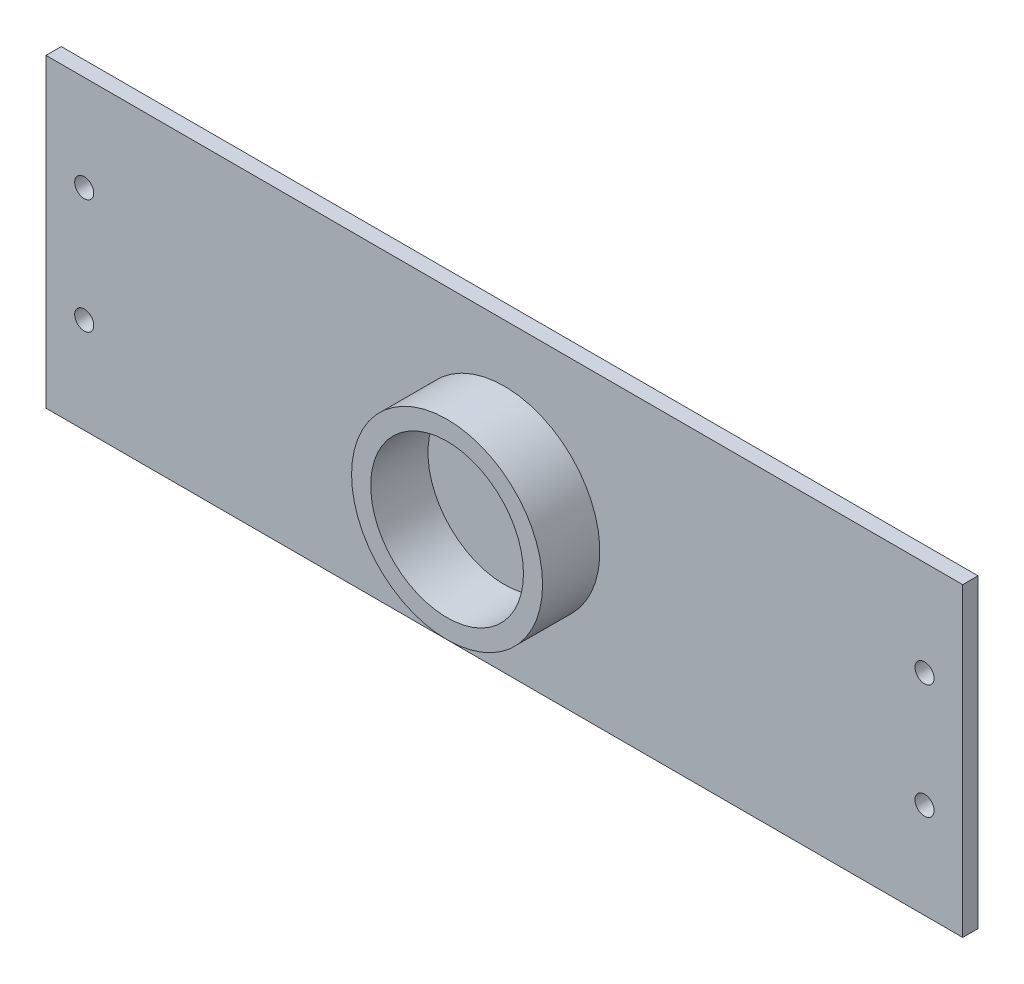
ISO-10303-21;
HEADER;
FILE_DESCRIPTION(('STEP AP214'),'2;1');
FILE_NAME('part.step','',(''),(''),'','','');
FILE_SCHEMA(('AUTOMOTIVE_DESIGN { 1 0 10303 214 1 1 1 1 }'));
ENDSEC;
DATA;
#1=APPLICATION_CONTEXT('core data for automotive mechanical design processes');
#2=APPLICATION_PROTOCOL_DEFINITION('international standard','automotive_design',2000,#1);
#3=PRODUCT_CONTEXT('',#1,'mechanical');
#4=PRODUCT('Part','Part','',(#3));
#5=PRODUCT_RELATED_PRODUCT_CATEGORY('part','',(#4));
#6=PRODUCT_DEFINITION_FORMATION('','',#4);
#7=PRODUCT_DEFINITION_CONTEXT('part definition',#1,'design');
#8=PRODUCT_DEFINITION('design','',#6,#7);
#9=PRODUCT_DEFINITION_SHAPE('','',#8);
#10=(LENGTH_UNIT() NAMED_UNIT(*) SI_UNIT(.MILLI.,.METRE.));
#11=(NAMED_UNIT(*) PLANE_ANGLE_UNIT() SI_UNIT($,.RADIAN.));
#12=(NAMED_UNIT(*) SI_UNIT($,.STERADIAN.) SOLID_ANGLE_UNIT());
#13=UNCERTAINTY_MEASURE_WITH_UNIT(LENGTH_MEASURE(1.E-05),#10,'distance_accuracy_value','');
#14=(GEOMETRIC_REPRESENTATION_CONTEXT(3) GLOBAL_UNCERTAINTY_ASSIGNED_CONTEXT((#13)) GLOBAL_UNIT_ASSIGNED_CONTEXT((#10,
#11,#12)) REPRESENTATION_CONTEXT('',''));
#15=CARTESIAN_POINT('',(0.,0.,0.));
#16=DIRECTION('',(0.,0.,1.));
#17=DIRECTION('',(1.,0.,0.));
#18=AXIS2_PLACEMENT_3D('',#15,#16,#17);
#19=CARTESIAN_POINT('',(0.,0.,4.));
#20=DIRECTION('',(0.,0.,-1.));
#21=DIRECTION('',(-1.,0.,0.));
#22=AXIS2_PLACEMENT_3D('',#19,#20,#21);
#23=PLANE('',#22);
#24=CARTESIAN_POINT('',(120.,40.,4.));
#25=DIRECTION('',(0.,0.,-1.));
#26=DIRECTION('',(-1.,0.,0.));
#27=AXIS2_PLACEMENT_3D('',#24,#25,#26);
#28=CIRCLE('',#27,25.);
#29=CARTESIAN_POINT('',(95.,40.,4.));
#30=VERTEX_POINT('',#29);
#31=EDGE_CURVE('E11',#30,#30,#28,.F.);
#32=ORIENTED_EDGE('',*,*,#31,.F.);
#33=EDGE_LOOP('',(#32));
#34=FACE_BOUND('',#33,.T.);
#35=DIRECTION('',(0.,-1.,0.));
#36=VECTOR('',#35,1.);
#37=CARTESIAN_POINT('',(0.,0.,4.));
#38=LINE('',#37,#36);
#39=CARTESIAN_POINT('',(0.,80.,4.));
#40=VERTEX_POINT('',#39);
#41=CARTESIAN_POINT('',(0.,0.,4.));
#42=VERTEX_POINT('',#41);
#43=EDGE_CURVE('E99',#40,#42,#38,.T.);
#44=ORIENTED_EDGE('',*,*,#43,.T.);
#45=DIRECTION('',(1.,0.,0.));
#46=VECTOR('',#45,1.);
#47=CARTESIAN_POINT('',(0.,0.,4.));
#48=LINE('',#47,#46);
#49=CARTESIAN_POINT('',(240.,0.,4.));
#50=VERTEX_POINT('',#49);
#51=EDGE_CURVE('E94',#42,#50,#48,.T.);
#52=ORIENTED_EDGE('',*,*,#51,.T.);
#53=DIRECTION('',(0.,1.,0.));
#54=VECTOR('',#53,1.);
#55=CARTESIAN_POINT('',(240.,0.,4.));
#56=LINE('',#55,#54);
#57=CARTESIAN_POINT('',(240.,80.,4.));
#58=VERTEX_POINT('',#57);
#59=EDGE_CURVE('E97',#50,#58,#56,.T.);
#60=ORIENTED_EDGE('',*,*,#59,.T.);
#61=DIRECTION('',(-1.,0.,0.));
#62=VECTOR('',#61,1.);
#63=CARTESIAN_POINT('',(0.,80.,4.));
#64=LINE('',#63,#62);
#65=EDGE_CURVE('E63',#58,#40,#64,.T.);
#66=ORIENTED_EDGE('',*,*,#65,.T.);
#67=EDGE_LOOP('',(#44,#52,#60,#66));
#68=FACE_BOUND('',#67,.T.);
#69=CARTESIAN_POINT('',(10.,55.,4.));
#70=DIRECTION('',(0.,0.,1.));
#71=DIRECTION('',(1.,0.,0.));
#72=AXIS2_PLACEMENT_3D('',#69,#70,#71);
#73=CIRCLE('',#72,2.5);
#74=CARTESIAN_POINT('',(12.5,55.,4.));
#75=VERTEX_POINT('',#74);
#76=EDGE_CURVE('E121',#75,#75,#73,.T.);
#77=ORIENTED_EDGE('',*,*,#76,.F.);
#78=EDGE_LOOP('',(#77));
#79=FACE_BOUND('',#78,.T.);
#80=CARTESIAN_POINT('',(10.,25.,4.));
#81=DIRECTION('',(0.,0.,1.));
#82=DIRECTION('',(1.,0.,0.));
#83=AXIS2_PLACEMENT_3D('',#80,#81,#82);
#84=CIRCLE('',#83,2.5);
#85=CARTESIAN_POINT('',(12.5,25.,4.));
#86=VERTEX_POINT('',#85);
#87=EDGE_CURVE('E168',#86,#86,#84,.T.);
#88=ORIENTED_EDGE('',*,*,#87,.F.);
#89=EDGE_LOOP('',(#88));
#90=FACE_BOUND('',#89,.T.);
#91=CARTESIAN_POINT('',(230.,25.,4.));
#92=DIRECTION('',(0.,0.,1.));
#93=DIRECTION('',(-1.,0.,0.));
#94=AXIS2_PLACEMENT_3D('',#91,#92,#93);
#95=CIRCLE('',#94,2.50000000000002);
#96=CARTESIAN_POINT('',(227.5,25.,4.));
#97=VERTEX_POINT('',#96);
#98=EDGE_CURVE('E161',#97,#97,#95,.T.);
#99=ORIENTED_EDGE('',*,*,#98,.F.);
#100=EDGE_LOOP('',(#99));
#101=FACE_BOUND('',#100,.T.);
#102=CARTESIAN_POINT('',(230.,55.,4.));
#103=DIRECTION('',(0.,0.,1.));
#104=DIRECTION('',(-1.,0.,0.));
#105=AXIS2_PLACEMENT_3D('',#102,#103,#104);
#106=CIRCLE('',#105,2.50000000000002);
#107=CARTESIAN_POINT('',(227.5,55.,4.));
#108=VERTEX_POINT('',#107);
#109=EDGE_CURVE('E149',#108,#108,#106,.T.);
#110=ORIENTED_EDGE('',*,*,#109,.F.);
#111=EDGE_LOOP('',(#110));
#112=FACE_BOUND('',#111,.T.);
#113=ADVANCED_FACE('F45',(#34,#68,#79,#90,#101,#112),#23,.F.);
#114=CARTESIAN_POINT('',(0.,0.,0.));
#115=DIRECTION('',(0.,0.,-1.));
#116=DIRECTION('',(-1.,0.,0.));
#117=AXIS2_PLACEMENT_3D('',#114,#115,#116);
#118=PLANE('',#117);
#119=CARTESIAN_POINT('',(230.,25.,0.));
#120=DIRECTION('',(0.,0.,1.));
#121=DIRECTION('',(-1.,0.,0.));
#122=AXIS2_PLACEMENT_3D('',#119,#120,#121);
#123=CIRCLE('',#122,2.50000000000002);
#124=CARTESIAN_POINT('',(227.5,25.,0.));
#125=VERTEX_POINT('',#124);
#126=EDGE_CURVE('E155',#125,#125,#123,.T.);
#127=ORIENTED_EDGE('',*,*,#126,.T.);
#128=EDGE_LOOP('',(#127));
#129=FACE_BOUND('',#128,.T.);
#130=CARTESIAN_POINT('',(10.,55.,0.));
#131=DIRECTION('',(0.,0.,1.));
#132=DIRECTION('',(1.,0.,0.));
#133=AXIS2_PLACEMENT_3D('',#130,#131,#132);
#134=CIRCLE('',#133,2.5);
#135=CARTESIAN_POINT('',(12.5,55.,0.));
#136=VERTEX_POINT('',#135);
#137=EDGE_CURVE('E172',#136,#136,#134,.T.);
#138=ORIENTED_EDGE('',*,*,#137,.T.);
#139=EDGE_LOOP('',(#138));
#140=FACE_BOUND('',#139,.T.);
#141=DIRECTION('',(0.,-1.,0.));
#142=VECTOR('',#141,1.);
#143=CARTESIAN_POINT('',(0.,0.,0.));
#144=LINE('',#143,#142);
#145=CARTESIAN_POINT('',(0.,80.,0.));
#146=VERTEX_POINT('',#145);
#147=CARTESIAN_POINT('',(0.,0.,0.));
#148=VERTEX_POINT('',#147);
#149=EDGE_CURVE('E117',#146,#148,#144,.T.);
#150=ORIENTED_EDGE('',*,*,#149,.F.);
#151=DIRECTION('',(-1.,0.,0.));
#152=VECTOR('',#151,1.);
#153=CARTESIAN_POINT('',(0.,80.,0.));
#154=LINE('',#153,#152);
#155=CARTESIAN_POINT('',(240.,80.,0.));
#156=VERTEX_POINT('',#155);
#157=EDGE_CURVE('E86',#156,#146,#154,.T.);
#158=ORIENTED_EDGE('',*,*,#157,.F.);
#159=DIRECTION('',(0.,1.,0.));
#160=VECTOR('',#159,1.);
#161=CARTESIAN_POINT('',(240.,0.,0.));
#162=LINE('',#161,#160);
#163=CARTESIAN_POINT('',(240.,0.,0.));
#164=VERTEX_POINT('',#163);
#165=EDGE_CURVE('E80',#164,#156,#162,.T.);
#166=ORIENTED_EDGE('',*,*,#165,.F.);
#167=DIRECTION('',(1.,0.,0.));
#168=VECTOR('',#167,1.);
#169=CARTESIAN_POINT('',(0.,0.,0.));
#170=LINE('',#169,#168);
#171=EDGE_CURVE('E105',#148,#164,#170,.T.);
#172=ORIENTED_EDGE('',*,*,#171,.F.);
#173=EDGE_LOOP('',(#150,#158,#166,#172));
#174=FACE_BOUND('',#173,.T.);
#175=CARTESIAN_POINT('',(10.,25.,0.));
#176=DIRECTION('',(0.,0.,1.));
#177=DIRECTION('',(1.,0.,0.));
#178=AXIS2_PLACEMENT_3D('',#175,#176,#177);
#179=CIRCLE('',#178,2.5);
#180=CARTESIAN_POINT('',(12.5,25.,0.));
#181=VERTEX_POINT('',#180);
#182=EDGE_CURVE('E143',#181,#181,#179,.T.);
#183=ORIENTED_EDGE('',*,*,#182,.T.);
#184=EDGE_LOOP('',(#183));
#185=FACE_BOUND('',#184,.T.);
#186=CARTESIAN_POINT('',(230.,55.,0.));
#187=DIRECTION('',(0.,0.,1.));
#188=DIRECTION('',(-1.,0.,0.));
#189=AXIS2_PLACEMENT_3D('',#186,#187,#188);
#190=CIRCLE('',#189,2.50000000000002);
#191=CARTESIAN_POINT('',(227.5,55.,0.));
#192=VERTEX_POINT('',#191);
#193=EDGE_CURVE('E146',#192,#192,#190,.T.);
#194=ORIENTED_EDGE('',*,*,#193,.T.);
#195=EDGE_LOOP('',(#194));
#196=FACE_BOUND('',#195,.T.);
#197=ADVANCED_FACE('F135',(#129,#140,#174,#185,#196),#118,.T.);
#198=CARTESIAN_POINT('',(0.,0.,4.));
#199=DIRECTION('',(1.,0.,0.));
#200=DIRECTION('',(0.,0.,-1.));
#201=AXIS2_PLACEMENT_3D('',#198,#199,#200);
#202=PLANE('',#201);
#203=ORIENTED_EDGE('',*,*,#149,.T.);
#204=DIRECTION('',(0.,0.,-1.));
#205=VECTOR('',#204,1.);
#206=CARTESIAN_POINT('',(0.,0.,4.));
#207=LINE('',#206,#205);
#208=EDGE_CURVE('E55',#42,#148,#207,.T.);
#209=ORIENTED_EDGE('',*,*,#208,.F.);
#210=ORIENTED_EDGE('',*,*,#43,.F.);
#211=DIRECTION('',(0.,0.,-1.));
#212=VECTOR('',#211,1.);
#213=CARTESIAN_POINT('',(0.,80.,4.));
#214=LINE('',#213,#212);
#215=EDGE_CURVE('E113',#40,#146,#214,.T.);
#216=ORIENTED_EDGE('',*,*,#215,.T.);
#217=EDGE_LOOP('',(#203,#209,#210,#216));
#218=FACE_BOUND('',#217,.T.);
#219=ADVANCED_FACE('F47',(#218),#202,.F.);
#220=CARTESIAN_POINT('',(0.,0.,4.));
#221=DIRECTION('',(0.,1.,0.));
#222=DIRECTION('',(0.,0.,1.));
#223=AXIS2_PLACEMENT_3D('',#220,#221,#222);
#224=PLANE('',#223);
#225=ORIENTED_EDGE('',*,*,#171,.T.);
#226=DIRECTION('',(0.,0.,-1.));
#227=VECTOR('',#226,1.);
#228=CARTESIAN_POINT('',(240.,0.,4.));
#229=LINE('',#228,#227);
#230=EDGE_CURVE('E103',#50,#164,#229,.T.);
#231=ORIENTED_EDGE('',*,*,#230,.F.);
#232=ORIENTED_EDGE('',*,*,#51,.F.);
#233=ORIENTED_EDGE('',*,*,#208,.T.);
#234=EDGE_LOOP('',(#225,#231,#232,#233));
#235=FACE_BOUND('',#234,.T.);
#236=ADVANCED_FACE('F104',(#235),#224,.F.);
#237=CARTESIAN_POINT('',(240.,0.,4.));
#238=DIRECTION('',(-1.,0.,0.));
#239=DIRECTION('',(0.,0.,1.));
#240=AXIS2_PLACEMENT_3D('',#237,#238,#239);
#241=PLANE('',#240);
#242=ORIENTED_EDGE('',*,*,#165,.T.);
#243=DIRECTION('',(0.,0.,-1.));
#244=VECTOR('',#243,1.);
#245=CARTESIAN_POINT('',(240.,80.,4.));
#246=LINE('',#245,#244);
#247=EDGE_CURVE('E107',#58,#156,#246,.T.);
#248=ORIENTED_EDGE('',*,*,#247,.F.);
#249=ORIENTED_EDGE('',*,*,#59,.F.);
#250=ORIENTED_EDGE('',*,*,#230,.T.);
#251=EDGE_LOOP('',(#242,#248,#249,#250));
#252=FACE_BOUND('',#251,.T.);
#253=ADVANCED_FACE('F109',(#252),#241,.F.);
#254=CARTESIAN_POINT('',(0.,80.,4.));
#255=DIRECTION('',(0.,-1.,0.));
#256=DIRECTION('',(0.,0.,-1.));
#257=AXIS2_PLACEMENT_3D('',#254,#255,#256);
#258=PLANE('',#257);
#259=ORIENTED_EDGE('',*,*,#157,.T.);
#260=ORIENTED_EDGE('',*,*,#215,.F.);
#261=ORIENTED_EDGE('',*,*,#65,.F.);
#262=ORIENTED_EDGE('',*,*,#247,.T.);
#263=EDGE_LOOP('',(#259,#260,#261,#262));
#264=FACE_BOUND('',#263,.T.);
#265=ADVANCED_FACE('F187',(#264),#258,.F.);
#266=CARTESIAN_POINT('',(10.,55.,4.));
#267=DIRECTION('',(0.,0.,-1.));
#268=DIRECTION('',(-1.,0.,0.));
#269=AXIS2_PLACEMENT_3D('',#266,#267,#268);
#270=CYLINDRICAL_SURFACE('',#269,2.5);
#271=ORIENTED_EDGE('',*,*,#76,.T.);
#272=EDGE_LOOP('',(#271));
#273=FACE_BOUND('',#272,.T.);
#274=ORIENTED_EDGE('',*,*,#137,.F.);
#275=EDGE_LOOP('',(#274));
#276=FACE_BOUND('',#275,.T.);
#277=ADVANCED_FACE('F184',(#273,#276),#270,.F.);
#278=CARTESIAN_POINT('',(10.,25.,4.));
#279=DIRECTION('',(0.,0.,-1.));
#280=DIRECTION('',(-1.,0.,0.));
#281=AXIS2_PLACEMENT_3D('',#278,#279,#280);
#282=CYLINDRICAL_SURFACE('',#281,2.5);
#283=ORIENTED_EDGE('',*,*,#87,.T.);
#284=EDGE_LOOP('',(#283));
#285=FACE_BOUND('',#284,.T.);
#286=ORIENTED_EDGE('',*,*,#182,.F.);
#287=EDGE_LOOP('',(#286));
#288=FACE_BOUND('',#287,.T.);
#289=ADVANCED_FACE('F186',(#285,#288),#282,.F.);
#290=CARTESIAN_POINT('',(230.,25.,4.));
#291=DIRECTION('',(0.,0.,-1.));
#292=DIRECTION('',(-1.,0.,0.));
#293=AXIS2_PLACEMENT_3D('',#290,#291,#292);
#294=CYLINDRICAL_SURFACE('',#293,2.50000000000002);
#295=ORIENTED_EDGE('',*,*,#98,.T.);
#296=EDGE_LOOP('',(#295));
#297=FACE_BOUND('',#296,.T.);
#298=ORIENTED_EDGE('',*,*,#126,.F.);
#299=EDGE_LOOP('',(#298));
#300=FACE_BOUND('',#299,.T.);
#301=ADVANCED_FACE('F194',(#297,#300),#294,.F.);
#302=CARTESIAN_POINT('',(230.,55.,4.));
#303=DIRECTION('',(0.,0.,-1.));
#304=DIRECTION('',(-1.,0.,0.));
#305=AXIS2_PLACEMENT_3D('',#302,#303,#304);
#306=CYLINDRICAL_SURFACE('',#305,2.50000000000002);
#307=ORIENTED_EDGE('',*,*,#109,.T.);
#308=EDGE_LOOP('',(#307));
#309=FACE_BOUND('',#308,.T.);
#310=ORIENTED_EDGE('',*,*,#193,.F.);
#311=EDGE_LOOP('',(#310));
#312=FACE_BOUND('',#311,.T.);
#313=ADVANCED_FACE('F228',(#309,#312),#306,.F.);
#314=CARTESIAN_POINT('',(120.,40.,19.));
#315=DIRECTION('',(0.,0.,1.));
#316=DIRECTION('',(1.,0.,0.));
#317=AXIS2_PLACEMENT_3D('',#314,#315,#316);
#318=PLANE('',#317);
#319=CARTESIAN_POINT('',(120.,40.,19.));
#320=DIRECTION('',(0.,0.,1.));
#321=DIRECTION('',(1.,0.,0.));
#322=AXIS2_PLACEMENT_3D('',#319,#320,#321);
#323=CIRCLE('',#322,25.);
#324=CARTESIAN_POINT('',(145.,40.,19.));
#325=VERTEX_POINT('',#324);
#326=EDGE_CURVE('E150',#325,#325,#323,.T.);
#327=ORIENTED_EDGE('',*,*,#326,.T.);
#328=EDGE_LOOP('',(#327));
#329=FACE_BOUND('',#328,.T.);
#330=CARTESIAN_POINT('',(120.,40.,19.));
#331=DIRECTION('',(0.,0.,1.));
#332=DIRECTION('',(1.,0.,0.));
#333=AXIS2_PLACEMENT_3D('',#330,#331,#332);
#334=CIRCLE('',#333,20.);
#335=CARTESIAN_POINT('',(140.,40.,19.));
#336=VERTEX_POINT('',#335);
#337=EDGE_CURVE('E158',#336,#336,#334,.T.);
#338=ORIENTED_EDGE('',*,*,#337,.F.);
#339=EDGE_LOOP('',(#338));
#340=FACE_BOUND('',#339,.T.);
#341=ADVANCED_FACE('F227',(#329,#340),#318,.T.);
#342=CARTESIAN_POINT('',(120.,40.,19.));
#343=DIRECTION('',(0.,0.,-1.));
#344=DIRECTION('',(-1.,0.,0.));
#345=AXIS2_PLACEMENT_3D('',#342,#343,#344);
#346=CYLINDRICAL_SURFACE('',#345,25.);
#347=ORIENTED_EDGE('',*,*,#326,.F.);
#348=EDGE_LOOP('',(#347));
#349=FACE_BOUND('',#348,.T.);
#350=ORIENTED_EDGE('',*,*,#31,.T.);
#351=EDGE_LOOP('',(#350));
#352=FACE_BOUND('',#351,.T.);
#353=ADVANCED_FACE('F213',(#349,#352),#346,.T.);
#354=CARTESIAN_POINT('',(120.,40.,19.));
#355=DIRECTION('',(0.,0.,-1.));
#356=DIRECTION('',(-1.,0.,0.));
#357=AXIS2_PLACEMENT_3D('',#354,#355,#356);
#358=CYLINDRICAL_SURFACE('',#357,20.);
#359=ORIENTED_EDGE('',*,*,#337,.T.);
#360=EDGE_LOOP('',(#359));
#361=FACE_BOUND('',#360,.T.);
#362=CARTESIAN_POINT('',(120.,40.,4.));
#363=DIRECTION('',(0.,0.,1.));
#364=DIRECTION('',(1.,0.,0.));
#365=AXIS2_PLACEMENT_3D('',#362,#363,#364);
#366=CIRCLE('',#365,20.);
#367=CARTESIAN_POINT('',(140.,40.,4.));
#368=VERTEX_POINT('',#367);
#369=EDGE_CURVE('E218',#368,#368,#366,.T.);
#370=ORIENTED_EDGE('',*,*,#369,.F.);
#371=EDGE_LOOP('',(#370));
#372=FACE_BOUND('',#371,.T.);
#373=ADVANCED_FACE('F208',(#361,#372),#358,.F.);
#374=ORIENTED_EDGE('',*,*,#369,.T.);
#375=EDGE_LOOP('',(#374));
#376=FACE_BOUND('',#375,.T.);
#377=ADVANCED_FACE('F201',(#376),#23,.F.);
#378=CLOSED_SHELL('',(#113,#197,#219,#236,#253,#265,#277,#289,#301,#313,#341,#353,#373,#377));
#379=MANIFOLD_SOLID_BREP('B2',#378);
#380=ADVANCED_BREP_SHAPE_REPRESENTATION('',(#18,#379),#14);
#381=SHAPE_DEFINITION_REPRESENTATION(#9,#380);
ENDSEC;
END-ISO-10303-21;
